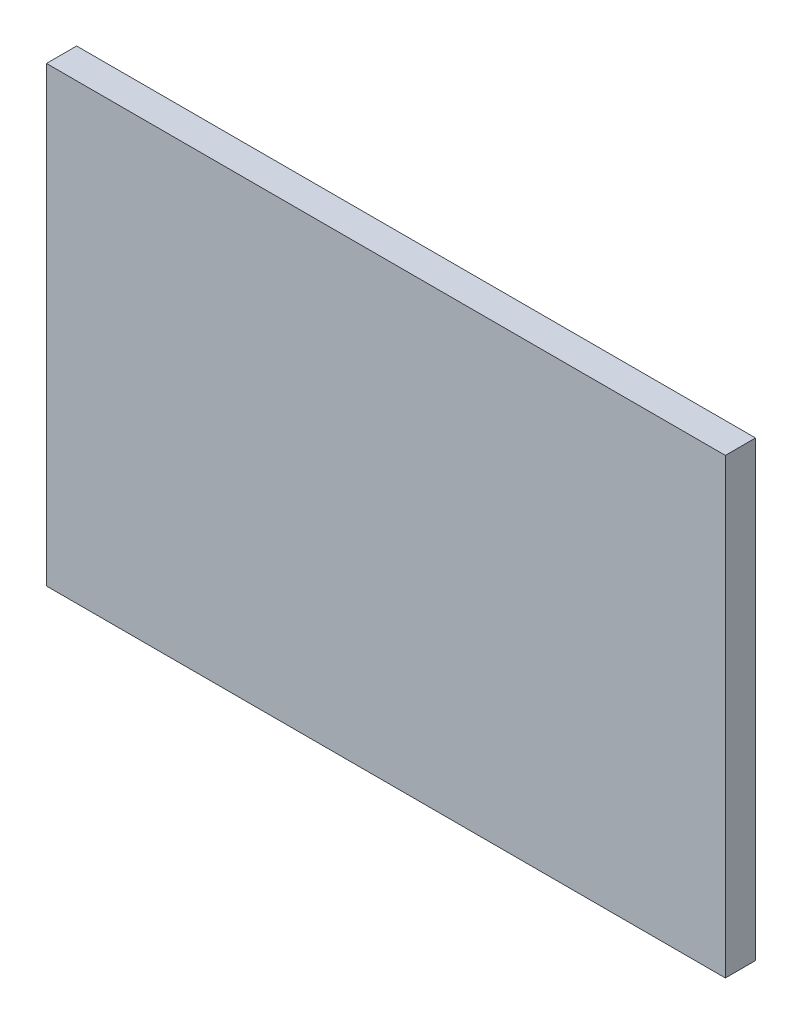
ISO-10303-21;
HEADER;
FILE_DESCRIPTION(('STEP AP214'),'2;1');
FILE_NAME('part.step','',(''),(''),'','','');
FILE_SCHEMA(('AUTOMOTIVE_DESIGN { 1 0 10303 214 1 1 1 1 }'));
ENDSEC;
DATA;
#1=APPLICATION_CONTEXT('core data for automotive mechanical design processes');
#2=APPLICATION_PROTOCOL_DEFINITION('international standard','automotive_design',2000,#1);
#3=PRODUCT_CONTEXT('',#1,'mechanical');
#4=PRODUCT('Part','Part','',(#3));
#5=PRODUCT_RELATED_PRODUCT_CATEGORY('part','',(#4));
#6=PRODUCT_DEFINITION_FORMATION('','',#4);
#7=PRODUCT_DEFINITION_CONTEXT('part definition',#1,'design');
#8=PRODUCT_DEFINITION('design','',#6,#7);
#9=PRODUCT_DEFINITION_SHAPE('','',#8);
#10=(LENGTH_UNIT() NAMED_UNIT(*) SI_UNIT(.MILLI.,.METRE.));
#11=(NAMED_UNIT(*) PLANE_ANGLE_UNIT() SI_UNIT($,.RADIAN.));
#12=(NAMED_UNIT(*) SI_UNIT($,.STERADIAN.) SOLID_ANGLE_UNIT());
#13=UNCERTAINTY_MEASURE_WITH_UNIT(LENGTH_MEASURE(1.E-05),#10,'distance_accuracy_value','');
#14=(GEOMETRIC_REPRESENTATION_CONTEXT(3) GLOBAL_UNCERTAINTY_ASSIGNED_CONTEXT((#13)) GLOBAL_UNIT_ASSIGNED_CONTEXT((#10,
#11,#12)) REPRESENTATION_CONTEXT('',''));
#15=CARTESIAN_POINT('',(0.,0.,0.));
#16=DIRECTION('',(0.,0.,1.));
#17=DIRECTION('',(1.,0.,0.));
#18=AXIS2_PLACEMENT_3D('',#15,#16,#17);
#19=CARTESIAN_POINT('',(-45.,-30.,4.));
#20=DIRECTION('',(1.,0.,0.));
#21=DIRECTION('',(0.,0.,-1.));
#22=AXIS2_PLACEMENT_3D('',#19,#20,#21);
#23=PLANE('',#22);
#24=DIRECTION('',(0.,-1.,0.));
#25=VECTOR('',#24,1.);
#26=CARTESIAN_POINT('',(-45.,-30.,0.));
#27=LINE('',#26,#25);
#28=CARTESIAN_POINT('',(-45.,30.,0.));
#29=VERTEX_POINT('',#28);
#30=CARTESIAN_POINT('',(-45.,-30.,0.));
#31=VERTEX_POINT('',#30);
#32=EDGE_CURVE('E102',#29,#31,#27,.T.);
#33=ORIENTED_EDGE('',*,*,#32,.T.);
#34=DIRECTION('',(0.,0.,-1.));
#35=VECTOR('',#34,1.);
#36=CARTESIAN_POINT('',(-45.,-30.,4.));
#37=LINE('',#36,#35);
#38=CARTESIAN_POINT('',(-45.,-30.,4.));
#39=VERTEX_POINT('',#38);
#40=EDGE_CURVE('E11',#39,#31,#37,.T.);
#41=ORIENTED_EDGE('',*,*,#40,.F.);
#42=DIRECTION('',(0.,-1.,0.));
#43=VECTOR('',#42,1.);
#44=CARTESIAN_POINT('',(-45.,-30.,4.));
#45=LINE('',#44,#43);
#46=CARTESIAN_POINT('',(-45.,30.,4.));
#47=VERTEX_POINT('',#46);
#48=EDGE_CURVE('E90',#47,#39,#45,.T.);
#49=ORIENTED_EDGE('',*,*,#48,.F.);
#50=DIRECTION('',(0.,0.,-1.));
#51=VECTOR('',#50,1.);
#52=CARTESIAN_POINT('',(-45.,30.,4.));
#53=LINE('',#52,#51);
#54=EDGE_CURVE('E98',#47,#29,#53,.T.);
#55=ORIENTED_EDGE('',*,*,#54,.T.);
#56=EDGE_LOOP('',(#33,#41,#49,#55));
#57=FACE_BOUND('',#56,.T.);
#58=ADVANCED_FACE('F39',(#57),#23,.F.);
#59=CARTESIAN_POINT('',(45.,-30.,4.));
#60=DIRECTION('',(0.,1.,0.));
#61=DIRECTION('',(-1.,0.,0.));
#62=AXIS2_PLACEMENT_3D('',#59,#60,#61);
#63=PLANE('',#62);
#64=DIRECTION('',(1.,0.,0.));
#65=VECTOR('',#64,1.);
#66=CARTESIAN_POINT('',(45.,-30.,0.));
#67=LINE('',#66,#65);
#68=CARTESIAN_POINT('',(45.,-30.,0.));
#69=VERTEX_POINT('',#68);
#70=EDGE_CURVE('E94',#31,#69,#67,.T.);
#71=ORIENTED_EDGE('',*,*,#70,.T.);
#72=DIRECTION('',(0.,0.,-1.));
#73=VECTOR('',#72,1.);
#74=CARTESIAN_POINT('',(45.,-30.,4.));
#75=LINE('',#74,#73);
#76=CARTESIAN_POINT('',(45.,-30.,4.));
#77=VERTEX_POINT('',#76);
#78=EDGE_CURVE('E47',#77,#69,#75,.T.);
#79=ORIENTED_EDGE('',*,*,#78,.F.);
#80=DIRECTION('',(1.,0.,0.));
#81=VECTOR('',#80,1.);
#82=CARTESIAN_POINT('',(45.,-30.,4.));
#83=LINE('',#82,#81);
#84=EDGE_CURVE('E85',#39,#77,#83,.T.);
#85=ORIENTED_EDGE('',*,*,#84,.F.);
#86=ORIENTED_EDGE('',*,*,#40,.T.);
#87=EDGE_LOOP('',(#71,#79,#85,#86));
#88=FACE_BOUND('',#87,.T.);
#89=ADVANCED_FACE('F93',(#88),#63,.F.);
#90=CARTESIAN_POINT('',(45.,-30.,4.));
#91=DIRECTION('',(-1.,0.,0.));
#92=DIRECTION('',(0.,0.,1.));
#93=AXIS2_PLACEMENT_3D('',#90,#91,#92);
#94=PLANE('',#93);
#95=DIRECTION('',(0.,1.,0.));
#96=VECTOR('',#95,1.);
#97=CARTESIAN_POINT('',(45.,-30.,0.));
#98=LINE('',#97,#96);
#99=CARTESIAN_POINT('',(45.,30.,0.));
#100=VERTEX_POINT('',#99);
#101=EDGE_CURVE('E72',#69,#100,#98,.T.);
#102=ORIENTED_EDGE('',*,*,#101,.T.);
#103=DIRECTION('',(0.,0.,-1.));
#104=VECTOR('',#103,1.);
#105=CARTESIAN_POINT('',(45.,30.,4.));
#106=LINE('',#105,#104);
#107=CARTESIAN_POINT('',(45.,30.,4.));
#108=VERTEX_POINT('',#107);
#109=EDGE_CURVE('E95',#108,#100,#106,.T.);
#110=ORIENTED_EDGE('',*,*,#109,.F.);
#111=DIRECTION('',(0.,1.,0.));
#112=VECTOR('',#111,1.);
#113=CARTESIAN_POINT('',(45.,-30.,4.));
#114=LINE('',#113,#112);
#115=EDGE_CURVE('E88',#77,#108,#114,.T.);
#116=ORIENTED_EDGE('',*,*,#115,.F.);
#117=ORIENTED_EDGE('',*,*,#78,.T.);
#118=EDGE_LOOP('',(#102,#110,#116,#117));
#119=FACE_BOUND('',#118,.T.);
#120=ADVANCED_FACE('F96',(#119),#94,.F.);
#121=CARTESIAN_POINT('',(45.,30.,4.));
#122=DIRECTION('',(0.,-1.,0.));
#123=DIRECTION('',(1.,0.,0.));
#124=AXIS2_PLACEMENT_3D('',#121,#122,#123);
#125=PLANE('',#124);
#126=DIRECTION('',(-1.,0.,0.));
#127=VECTOR('',#126,1.);
#128=CARTESIAN_POINT('',(45.,30.,0.));
#129=LINE('',#128,#127);
#130=EDGE_CURVE('E78',#100,#29,#129,.T.);
#131=ORIENTED_EDGE('',*,*,#130,.T.);
#132=ORIENTED_EDGE('',*,*,#54,.F.);
#133=DIRECTION('',(-1.,0.,0.));
#134=VECTOR('',#133,1.);
#135=CARTESIAN_POINT('',(45.,30.,4.));
#136=LINE('',#135,#134);
#137=EDGE_CURVE('E55',#108,#47,#136,.T.);
#138=ORIENTED_EDGE('',*,*,#137,.F.);
#139=ORIENTED_EDGE('',*,*,#109,.T.);
#140=EDGE_LOOP('',(#131,#132,#138,#139));
#141=FACE_BOUND('',#140,.T.);
#142=ADVANCED_FACE('F109',(#141),#125,.F.);
#143=CARTESIAN_POINT('',(0.,0.,4.));
#144=DIRECTION('',(0.,0.,1.));
#145=DIRECTION('',(1.,0.,0.));
#146=AXIS2_PLACEMENT_3D('',#143,#144,#145);
#147=PLANE('',#146);
#148=ORIENTED_EDGE('',*,*,#48,.T.);
#149=ORIENTED_EDGE('',*,*,#84,.T.);
#150=ORIENTED_EDGE('',*,*,#115,.T.);
#151=ORIENTED_EDGE('',*,*,#137,.T.);
#152=EDGE_LOOP('',(#148,#149,#150,#151));
#153=FACE_BOUND('',#152,.T.);
#154=ADVANCED_FACE('F86',(#153),#147,.T.);
#155=CARTESIAN_POINT('',(0.,0.,0.));
#156=DIRECTION('',(0.,0.,1.));
#157=DIRECTION('',(1.,0.,0.));
#158=AXIS2_PLACEMENT_3D('',#155,#156,#157);
#159=PLANE('',#158);
#160=ORIENTED_EDGE('',*,*,#32,.F.);
#161=ORIENTED_EDGE('',*,*,#130,.F.);
#162=ORIENTED_EDGE('',*,*,#101,.F.);
#163=ORIENTED_EDGE('',*,*,#70,.F.);
#164=EDGE_LOOP('',(#160,#161,#162,#163));
#165=FACE_BOUND('',#164,.T.);
#166=ADVANCED_FACE('F112',(#165),#159,.F.);
#167=CLOSED_SHELL('',(#58,#89,#120,#142,#154,#166));
#168=MANIFOLD_SOLID_BREP('B2',#167);
#169=ADVANCED_BREP_SHAPE_REPRESENTATION('',(#18,#168),#14);
#170=SHAPE_DEFINITION_REPRESENTATION(#9,#169);
ENDSEC;
END-ISO-10303-21;
